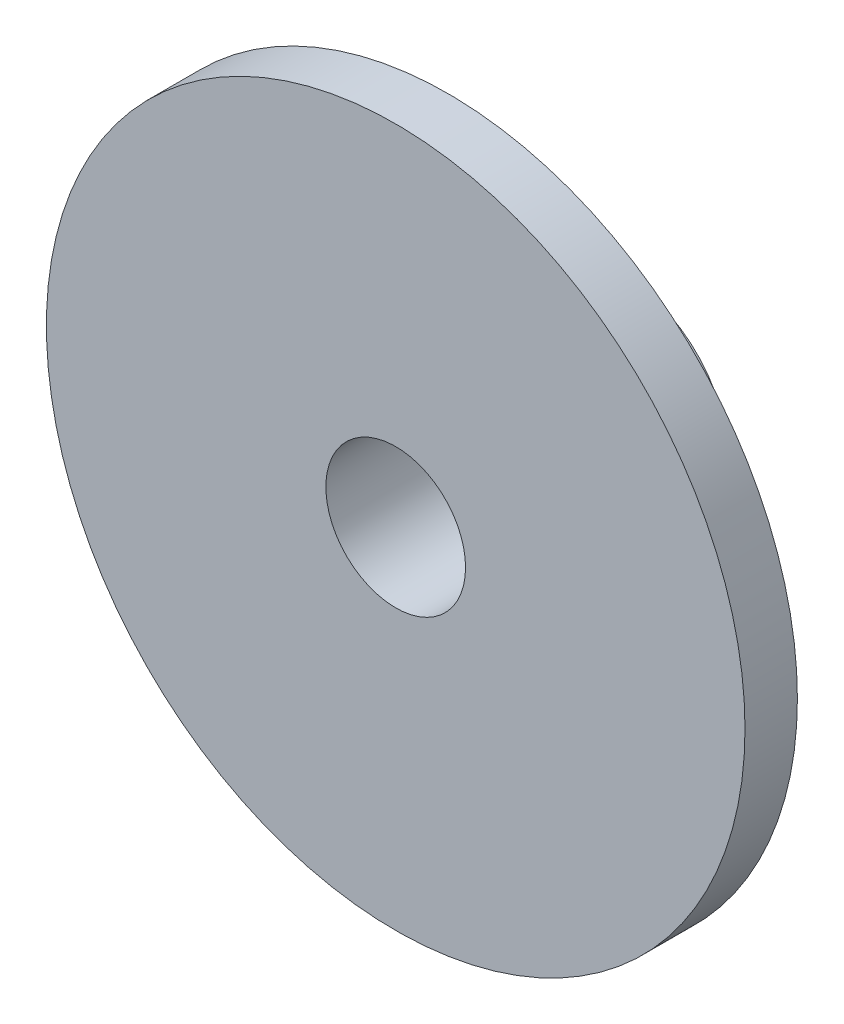
ISO-10303-21;
HEADER;
FILE_DESCRIPTION(('STEP AP214'),'2;1');
FILE_NAME('part.step','',(''),(''),'','','');
FILE_SCHEMA(('AUTOMOTIVE_DESIGN { 1 0 10303 214 1 1 1 1 }'));
ENDSEC;
DATA;
#1=APPLICATION_CONTEXT('core data for automotive mechanical design processes');
#2=APPLICATION_PROTOCOL_DEFINITION('international standard','automotive_design',2000,#1);
#3=PRODUCT_CONTEXT('',#1,'mechanical');
#4=PRODUCT('Part','Part','',(#3));
#5=PRODUCT_RELATED_PRODUCT_CATEGORY('part','',(#4));
#6=PRODUCT_DEFINITION_FORMATION('','',#4);
#7=PRODUCT_DEFINITION_CONTEXT('part definition',#1,'design');
#8=PRODUCT_DEFINITION('design','',#6,#7);
#9=PRODUCT_DEFINITION_SHAPE('','',#8);
#10=(LENGTH_UNIT() NAMED_UNIT(*) SI_UNIT(.MILLI.,.METRE.));
#11=(NAMED_UNIT(*) PLANE_ANGLE_UNIT() SI_UNIT($,.RADIAN.));
#12=(NAMED_UNIT(*) SI_UNIT($,.STERADIAN.) SOLID_ANGLE_UNIT());
#13=UNCERTAINTY_MEASURE_WITH_UNIT(LENGTH_MEASURE(1.E-05),#10,'distance_accuracy_value','');
#14=(GEOMETRIC_REPRESENTATION_CONTEXT(3) GLOBAL_UNCERTAINTY_ASSIGNED_CONTEXT((#13)) GLOBAL_UNIT_ASSIGNED_CONTEXT((#10,
#11,#12)) REPRESENTATION_CONTEXT('',''));
#15=CARTESIAN_POINT('',(0.,0.,0.));
#16=DIRECTION('',(0.,0.,1.));
#17=DIRECTION('',(1.,0.,0.));
#18=AXIS2_PLACEMENT_3D('',#15,#16,#17);
#19=CARTESIAN_POINT('',(0.,20.,0.));
#20=DIRECTION('',(0.,0.,-1.));
#21=DIRECTION('',(-1.,0.,0.));
#22=AXIS2_PLACEMENT_3D('',#19,#20,#21);
#23=PLANE('',#22);
#24=CARTESIAN_POINT('',(0.,0.,0.));
#25=DIRECTION('',(0.,0.,1.));
#26=DIRECTION('',(1.,0.,0.));
#27=AXIS2_PLACEMENT_3D('',#24,#25,#26);
#28=CIRCLE('',#27,4.);
#29=CARTESIAN_POINT('',(4.,0.,0.));
#30=VERTEX_POINT('',#29);
#31=EDGE_CURVE('E12',#30,#30,#28,.T.);
#32=ORIENTED_EDGE('',*,*,#31,.F.);
#33=EDGE_LOOP('',(#32));
#34=FACE_BOUND('',#33,.T.);
#35=CARTESIAN_POINT('',(0.,0.,0.));
#36=DIRECTION('',(0.,0.,1.));
#37=DIRECTION('',(1.,0.,0.));
#38=AXIS2_PLACEMENT_3D('',#35,#36,#37);
#39=CIRCLE('',#38,20.);
#40=CARTESIAN_POINT('',(20.,0.,0.));
#41=VERTEX_POINT('',#40);
#42=EDGE_CURVE('E62',#41,#41,#39,.T.);
#43=ORIENTED_EDGE('',*,*,#42,.T.);
#44=EDGE_LOOP('',(#43));
#45=FACE_BOUND('',#44,.T.);
#46=ADVANCED_FACE('F40',(#34,#45),#23,.F.);
#47=CARTESIAN_POINT('',(0.,0.,0.));
#48=DIRECTION('',(0.,0.,1.));
#49=DIRECTION('',(1.,0.,0.));
#50=AXIS2_PLACEMENT_3D('',#47,#48,#49);
#51=CYLINDRICAL_SURFACE('',#50,4.);
#52=CARTESIAN_POINT('',(0.,0.,-13.));
#53=DIRECTION('',(0.,0.,1.));
#54=DIRECTION('',(1.,0.,0.));
#55=AXIS2_PLACEMENT_3D('',#52,#53,#54);
#56=CIRCLE('',#55,4.);
#57=CARTESIAN_POINT('',(4.,0.,-13.));
#58=VERTEX_POINT('',#57);
#59=EDGE_CURVE('E46',#58,#58,#56,.T.);
#60=ORIENTED_EDGE('',*,*,#59,.F.);
#61=EDGE_LOOP('',(#60));
#62=FACE_BOUND('',#61,.T.);
#63=ORIENTED_EDGE('',*,*,#31,.T.);
#64=EDGE_LOOP('',(#63));
#65=FACE_BOUND('',#64,.T.);
#66=ADVANCED_FACE('F87',(#62,#65),#51,.F.);
#67=CARTESIAN_POINT('',(0.,4.,-13.));
#68=DIRECTION('',(0.,0.,1.));
#69=DIRECTION('',(1.,0.,0.));
#70=AXIS2_PLACEMENT_3D('',#67,#68,#69);
#71=PLANE('',#70);
#72=CARTESIAN_POINT('',(0.,0.,-13.));
#73=DIRECTION('',(0.,0.,1.));
#74=DIRECTION('',(1.,0.,0.));
#75=AXIS2_PLACEMENT_3D('',#72,#73,#74);
#76=CIRCLE('',#75,6.);
#77=CARTESIAN_POINT('',(6.,0.,-13.));
#78=VERTEX_POINT('',#77);
#79=EDGE_CURVE('E50',#78,#78,#76,.T.);
#80=ORIENTED_EDGE('',*,*,#79,.F.);
#81=EDGE_LOOP('',(#80));
#82=FACE_BOUND('',#81,.T.);
#83=ORIENTED_EDGE('',*,*,#59,.T.);
#84=EDGE_LOOP('',(#83));
#85=FACE_BOUND('',#84,.T.);
#86=ADVANCED_FACE('F82',(#82,#85),#71,.F.);
#87=CARTESIAN_POINT('',(0.,0.,0.));
#88=DIRECTION('',(0.,0.,1.));
#89=DIRECTION('',(1.,0.,0.));
#90=AXIS2_PLACEMENT_3D('',#87,#88,#89);
#91=CYLINDRICAL_SURFACE('',#90,6.);
#92=CARTESIAN_POINT('',(0.,0.,-3.));
#93=DIRECTION('',(0.,0.,1.));
#94=DIRECTION('',(1.,0.,0.));
#95=AXIS2_PLACEMENT_3D('',#92,#93,#94);
#96=CIRCLE('',#95,6.);
#97=CARTESIAN_POINT('',(6.,0.,-3.));
#98=VERTEX_POINT('',#97);
#99=EDGE_CURVE('E54',#98,#98,#96,.T.);
#100=ORIENTED_EDGE('',*,*,#99,.F.);
#101=EDGE_LOOP('',(#100));
#102=FACE_BOUND('',#101,.T.);
#103=ORIENTED_EDGE('',*,*,#79,.T.);
#104=EDGE_LOOP('',(#103));
#105=FACE_BOUND('',#104,.T.);
#106=ADVANCED_FACE('F76',(#102,#105),#91,.T.);
#107=CARTESIAN_POINT('',(0.,6.,-3.));
#108=DIRECTION('',(0.,0.,1.));
#109=DIRECTION('',(1.,0.,0.));
#110=AXIS2_PLACEMENT_3D('',#107,#108,#109);
#111=PLANE('',#110);
#112=CARTESIAN_POINT('',(0.,0.,-3.));
#113=DIRECTION('',(0.,0.,1.));
#114=DIRECTION('',(1.,0.,0.));
#115=AXIS2_PLACEMENT_3D('',#112,#113,#114);
#116=CIRCLE('',#115,20.);
#117=CARTESIAN_POINT('',(20.,0.,-3.));
#118=VERTEX_POINT('',#117);
#119=EDGE_CURVE('E59',#118,#118,#116,.T.);
#120=ORIENTED_EDGE('',*,*,#119,.F.);
#121=EDGE_LOOP('',(#120));
#122=FACE_BOUND('',#121,.T.);
#123=ORIENTED_EDGE('',*,*,#99,.T.);
#124=EDGE_LOOP('',(#123));
#125=FACE_BOUND('',#124,.T.);
#126=ADVANCED_FACE('F70',(#122,#125),#111,.F.);
#127=CARTESIAN_POINT('',(0.,0.,0.));
#128=DIRECTION('',(0.,0.,1.));
#129=DIRECTION('',(1.,0.,0.));
#130=AXIS2_PLACEMENT_3D('',#127,#128,#129);
#131=CYLINDRICAL_SURFACE('',#130,20.);
#132=ORIENTED_EDGE('',*,*,#42,.F.);
#133=EDGE_LOOP('',(#132));
#134=FACE_BOUND('',#133,.T.);
#135=ORIENTED_EDGE('',*,*,#119,.T.);
#136=EDGE_LOOP('',(#135));
#137=FACE_BOUND('',#136,.T.);
#138=ADVANCED_FACE('F67',(#134,#137),#131,.T.);
#139=CLOSED_SHELL('',(#46,#66,#86,#106,#126,#138));
#140=MANIFOLD_SOLID_BREP('B2',#139);
#141=ADVANCED_BREP_SHAPE_REPRESENTATION('',(#18,#140),#14);
#142=SHAPE_DEFINITION_REPRESENTATION(#9,#141);
ENDSEC;
END-ISO-10303-21;
